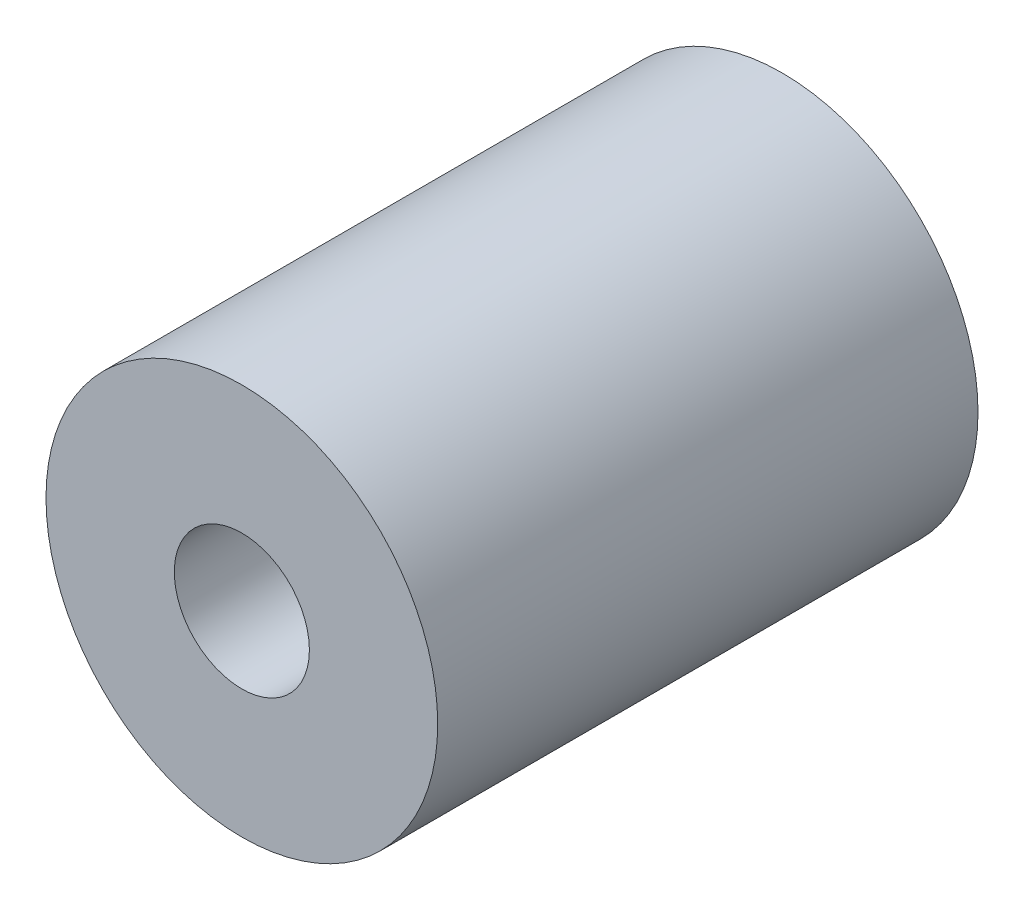
ISO-10303-21;
HEADER;
FILE_DESCRIPTION(('STEP AP214'),'2;1');
FILE_NAME('part.step','',(''),(''),'','','');
FILE_SCHEMA(('AUTOMOTIVE_DESIGN { 1 0 10303 214 1 1 1 1 }'));
ENDSEC;
DATA;
#1=APPLICATION_CONTEXT('core data for automotive mechanical design processes');
#2=APPLICATION_PROTOCOL_DEFINITION('international standard','automotive_design',2000,#1);
#3=PRODUCT_CONTEXT('',#1,'mechanical');
#4=PRODUCT('Part','Part','',(#3));
#5=PRODUCT_RELATED_PRODUCT_CATEGORY('part','',(#4));
#6=PRODUCT_DEFINITION_FORMATION('','',#4);
#7=PRODUCT_DEFINITION_CONTEXT('part definition',#1,'design');
#8=PRODUCT_DEFINITION('design','',#6,#7);
#9=PRODUCT_DEFINITION_SHAPE('','',#8);
#10=(LENGTH_UNIT() NAMED_UNIT(*) SI_UNIT(.MILLI.,.METRE.));
#11=(NAMED_UNIT(*) PLANE_ANGLE_UNIT() SI_UNIT($,.RADIAN.));
#12=(NAMED_UNIT(*) SI_UNIT($,.STERADIAN.) SOLID_ANGLE_UNIT());
#13=UNCERTAINTY_MEASURE_WITH_UNIT(LENGTH_MEASURE(1.E-05),#10,'distance_accuracy_value','');
#14=(GEOMETRIC_REPRESENTATION_CONTEXT(3) GLOBAL_UNCERTAINTY_ASSIGNED_CONTEXT((#13)) GLOBAL_UNIT_ASSIGNED_CONTEXT((#10,
#11,#12)) REPRESENTATION_CONTEXT('',''));
#15=CARTESIAN_POINT('',(0.,0.,0.));
#16=DIRECTION('',(0.,0.,1.));
#17=DIRECTION('',(1.,0.,0.));
#18=AXIS2_PLACEMENT_3D('',#15,#16,#17);
#19=CARTESIAN_POINT('',(0.,0.,8.));
#20=DIRECTION('',(0.,0.,1.));
#21=DIRECTION('',(1.,0.,0.));
#22=AXIS2_PLACEMENT_3D('',#19,#20,#21);
#23=PLANE('',#22);
#24=CARTESIAN_POINT('',(0.,0.,8.));
#25=DIRECTION('',(0.,0.,1.));
#26=DIRECTION('',(1.,0.,0.));
#27=AXIS2_PLACEMENT_3D('',#24,#25,#26);
#28=CIRCLE('',#27,2.9);
#29=CARTESIAN_POINT('',(2.9,0.,8.));
#30=VERTEX_POINT('',#29);
#31=EDGE_CURVE('E10',#30,#30,#28,.T.);
#32=ORIENTED_EDGE('',*,*,#31,.T.);
#33=EDGE_LOOP('',(#32));
#34=FACE_BOUND('',#33,.T.);
#35=CARTESIAN_POINT('',(0.,0.,8.));
#36=DIRECTION('',(0.,0.,1.));
#37=DIRECTION('',(1.,0.,0.));
#38=AXIS2_PLACEMENT_3D('',#35,#36,#37);
#39=CIRCLE('',#38,1.);
#40=CARTESIAN_POINT('',(1.,0.,8.));
#41=VERTEX_POINT('',#40);
#42=EDGE_CURVE('E50',#41,#41,#39,.T.);
#43=ORIENTED_EDGE('',*,*,#42,.F.);
#44=EDGE_LOOP('',(#43));
#45=FACE_BOUND('',#44,.T.);
#46=ADVANCED_FACE('F37',(#34,#45),#23,.T.);
#47=CARTESIAN_POINT('',(0.,0.,0.));
#48=DIRECTION('',(0.,0.,1.));
#49=DIRECTION('',(1.,0.,0.));
#50=AXIS2_PLACEMENT_3D('',#47,#48,#49);
#51=PLANE('',#50);
#52=CARTESIAN_POINT('',(0.,0.,0.));
#53=DIRECTION('',(0.,0.,1.));
#54=DIRECTION('',(1.,0.,0.));
#55=AXIS2_PLACEMENT_3D('',#52,#53,#54);
#56=CIRCLE('',#55,2.9);
#57=CARTESIAN_POINT('',(2.9,0.,0.));
#58=VERTEX_POINT('',#57);
#59=EDGE_CURVE('E41',#58,#58,#56,.T.);
#60=ORIENTED_EDGE('',*,*,#59,.F.);
#61=EDGE_LOOP('',(#60));
#62=FACE_BOUND('',#61,.T.);
#63=CARTESIAN_POINT('',(0.,0.,0.));
#64=DIRECTION('',(0.,0.,1.));
#65=DIRECTION('',(1.,0.,0.));
#66=AXIS2_PLACEMENT_3D('',#63,#64,#65);
#67=CIRCLE('',#66,1.);
#68=CARTESIAN_POINT('',(1.,0.,0.));
#69=VERTEX_POINT('',#68);
#70=EDGE_CURVE('E52',#69,#69,#67,.T.);
#71=ORIENTED_EDGE('',*,*,#70,.T.);
#72=EDGE_LOOP('',(#71));
#73=FACE_BOUND('',#72,.T.);
#74=ADVANCED_FACE('F64',(#62,#73),#51,.F.);
#75=CARTESIAN_POINT('',(0.,0.,8.));
#76=DIRECTION('',(0.,0.,-1.));
#77=DIRECTION('',(-1.,0.,0.));
#78=AXIS2_PLACEMENT_3D('',#75,#76,#77);
#79=CYLINDRICAL_SURFACE('',#78,2.9);
#80=ORIENTED_EDGE('',*,*,#31,.F.);
#81=EDGE_LOOP('',(#80));
#82=FACE_BOUND('',#81,.T.);
#83=ORIENTED_EDGE('',*,*,#59,.T.);
#84=EDGE_LOOP('',(#83));
#85=FACE_BOUND('',#84,.T.);
#86=ADVANCED_FACE('F39',(#82,#85),#79,.T.);
#87=CARTESIAN_POINT('',(0.,0.,8.));
#88=DIRECTION('',(0.,0.,-1.));
#89=DIRECTION('',(-1.,0.,0.));
#90=AXIS2_PLACEMENT_3D('',#87,#88,#89);
#91=CYLINDRICAL_SURFACE('',#90,1.);
#92=ORIENTED_EDGE('',*,*,#42,.T.);
#93=EDGE_LOOP('',(#92));
#94=FACE_BOUND('',#93,.T.);
#95=ORIENTED_EDGE('',*,*,#70,.F.);
#96=EDGE_LOOP('',(#95));
#97=FACE_BOUND('',#96,.T.);
#98=ADVANCED_FACE('F60',(#94,#97),#91,.F.);
#99=CLOSED_SHELL('',(#46,#74,#86,#98));
#100=MANIFOLD_SOLID_BREP('B2',#99);
#101=ADVANCED_BREP_SHAPE_REPRESENTATION('',(#18,#100),#14);
#102=SHAPE_DEFINITION_REPRESENTATION(#9,#101);
ENDSEC;
END-ISO-10303-21;
